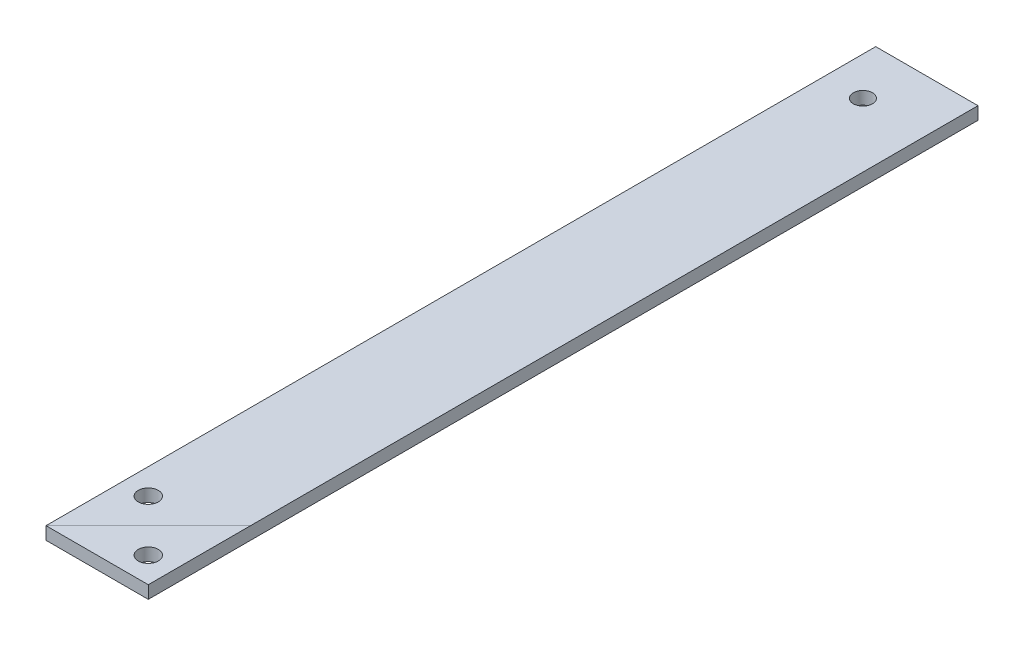
ISO-10303-21;
HEADER;
FILE_DESCRIPTION(('STEP AP214'),'2;1');
FILE_NAME('part.step','',(''),(''),'','','');
FILE_SCHEMA(('AUTOMOTIVE_DESIGN { 1 0 10303 214 1 1 1 1 }'));
ENDSEC;
DATA;
#1=APPLICATION_CONTEXT('core data for automotive mechanical design processes');
#2=APPLICATION_PROTOCOL_DEFINITION('international standard','automotive_design',2000,#1);
#3=PRODUCT_CONTEXT('',#1,'mechanical');
#4=PRODUCT('Part','Part','',(#3));
#5=PRODUCT_RELATED_PRODUCT_CATEGORY('part','',(#4));
#6=PRODUCT_DEFINITION_FORMATION('','',#4);
#7=PRODUCT_DEFINITION_CONTEXT('part definition',#1,'design');
#8=PRODUCT_DEFINITION('design','',#6,#7);
#9=PRODUCT_DEFINITION_SHAPE('','',#8);
#10=(LENGTH_UNIT() NAMED_UNIT(*) SI_UNIT(.MILLI.,.METRE.));
#11=(NAMED_UNIT(*) PLANE_ANGLE_UNIT() SI_UNIT($,.RADIAN.));
#12=(NAMED_UNIT(*) SI_UNIT($,.STERADIAN.) SOLID_ANGLE_UNIT());
#13=UNCERTAINTY_MEASURE_WITH_UNIT(LENGTH_MEASURE(1.E-05),#10,'distance_accuracy_value','');
#14=(GEOMETRIC_REPRESENTATION_CONTEXT(3) GLOBAL_UNCERTAINTY_ASSIGNED_CONTEXT((#13)) GLOBAL_UNIT_ASSIGNED_CONTEXT((#10,
#11,#12)) REPRESENTATION_CONTEXT('',''));
#15=CARTESIAN_POINT('',(0.,0.,0.));
#16=DIRECTION('',(0.,0.,1.));
#17=DIRECTION('',(1.,0.,0.));
#18=AXIS2_PLACEMENT_3D('',#15,#16,#17);
#19=CARTESIAN_POINT('',(0.,6.31,0.));
#20=DIRECTION('',(0.,1.,0.));
#21=DIRECTION('',(0.,0.,1.));
#22=AXIS2_PLACEMENT_3D('',#19,#20,#21);
#23=PLANE('',#22);
#24=CARTESIAN_POINT('',(-12.7000000000304,6.31,222.125660605838));
#25=DIRECTION('',(0.,1.,0.));
#26=DIRECTION('',(0.,0.,1.));
#27=AXIS2_PLACEMENT_3D('',#24,#25,#26);
#28=CIRCLE('',#27,5.);
#29=CARTESIAN_POINT('',(-12.7000000000304,6.31,227.125660605838));
#30=VERTEX_POINT('',#29);
#31=EDGE_CURVE('E186',#30,#30,#28,.T.);
#32=ORIENTED_EDGE('',*,*,#31,.F.);
#33=EDGE_LOOP('',(#32));
#34=FACE_BOUND('',#33,.T.);
#35=CARTESIAN_POINT('',(-6.36,6.31,-126.469999999989));
#36=DIRECTION('',(0.,1.,0.));
#37=DIRECTION('',(0.,0.,1.));
#38=AXIS2_PLACEMENT_3D('',#35,#36,#37);
#39=CIRCLE('',#38,4.7625);
#40=CARTESIAN_POINT('',(-6.36,6.31,-121.707499999989));
#41=VERTEX_POINT('',#40);
#42=EDGE_CURVE('E124',#41,#41,#39,.T.);
#43=ORIENTED_EDGE('',*,*,#42,.F.);
#44=EDGE_LOOP('',(#43));
#45=FACE_BOUND('',#44,.T.);
#46=DIRECTION('',(0.,0.,-1.));
#47=VECTOR('',#46,1.);
#48=CARTESIAN_POINT('',(25.4,6.31,151.87));
#49=LINE('',#48,#47);
#50=CARTESIAN_POINT('',(25.4,6.31,209.425660605845));
#51=VERTEX_POINT('',#50);
#52=CARTESIAN_POINT('',(25.4,6.31,-151.87));
#53=VERTEX_POINT('',#52);
#54=EDGE_CURVE('E99',#51,#53,#49,.T.);
#55=ORIENTED_EDGE('',*,*,#54,.T.);
#56=DIRECTION('',(-1.,0.,0.));
#57=VECTOR('',#56,1.);
#58=CARTESIAN_POINT('',(25.4,6.31,-151.87));
#59=LINE('',#58,#57);
#60=CARTESIAN_POINT('',(-25.4,6.31,-151.87));
#61=VERTEX_POINT('',#60);
#62=EDGE_CURVE('E58',#53,#61,#59,.T.);
#63=ORIENTED_EDGE('',*,*,#62,.T.);
#64=DIRECTION('',(0.,0.,1.));
#65=VECTOR('',#64,1.);
#66=CARTESIAN_POINT('',(-25.4,6.31,151.87));
#67=LINE('',#66,#65);
#68=CARTESIAN_POINT('',(-25.4,6.31,260.225660605844));
#69=VERTEX_POINT('',#68);
#70=EDGE_CURVE('E72',#61,#69,#67,.T.);
#71=ORIENTED_EDGE('',*,*,#70,.T.);
#72=DIRECTION('',(0.707106781186548,0.,-0.707106781186548));
#73=VECTOR('',#72,1.);
#74=CARTESIAN_POINT('',(28.7778303029223,6.31,206.047830302922));
#75=LINE('',#74,#73);
#76=EDGE_CURVE('E93',#69,#51,#75,.T.);
#77=ORIENTED_EDGE('',*,*,#76,.T.);
#78=EDGE_LOOP('',(#55,#63,#71,#77));
#79=FACE_BOUND('',#78,.T.);
#80=ADVANCED_FACE('F32',(#34,#45,#79),#23,.T.);
#81=CARTESIAN_POINT('',(-28.04,0.,260.225660605845));
#82=DIRECTION('',(0.,-1.,0.));
#83=DIRECTION('',(0.,0.,-1.));
#84=AXIS2_PLACEMENT_3D('',#81,#82,#83);
#85=PLANE('',#84);
#86=CARTESIAN_POINT('',(12.6999999999799,0.,247.525660605849));
#87=DIRECTION('',(0.,-1.,0.));
#88=DIRECTION('',(0.,0.,-1.));
#89=AXIS2_PLACEMENT_3D('',#86,#87,#88);
#90=CIRCLE('',#89,5.);
#91=CARTESIAN_POINT('',(12.6999999999799,0.,252.525660605849));
#92=VERTEX_POINT('',#91);
#93=EDGE_CURVE('E128',#92,#92,#90,.T.);
#94=ORIENTED_EDGE('',*,*,#93,.F.);
#95=EDGE_LOOP('',(#94));
#96=FACE_BOUND('',#95,.T.);
#97=DIRECTION('',(0.,0.,-1.));
#98=VECTOR('',#97,1.);
#99=CARTESIAN_POINT('',(25.4000000000001,0.,260.225660605844));
#100=LINE('',#99,#98);
#101=CARTESIAN_POINT('',(25.4000000000001,0.,260.225660605844));
#102=VERTEX_POINT('',#101);
#103=CARTESIAN_POINT('',(25.4,0.,209.425660605845));
#104=VERTEX_POINT('',#103);
#105=EDGE_CURVE('E109',#102,#104,#100,.T.);
#106=ORIENTED_EDGE('',*,*,#105,.F.);
#107=DIRECTION('',(1.,0.,0.));
#108=VECTOR('',#107,1.);
#109=CARTESIAN_POINT('',(-28.04,0.,260.225660605845));
#110=LINE('',#109,#108);
#111=CARTESIAN_POINT('',(-25.4,0.,260.225660605845));
#112=VERTEX_POINT('',#111);
#113=EDGE_CURVE('E114',#112,#102,#110,.T.);
#114=ORIENTED_EDGE('',*,*,#113,.F.);
#115=DIRECTION('',(-0.707106781186548,0.,0.707106781186548));
#116=VECTOR('',#115,1.);
#117=CARTESIAN_POINT('',(28.7778303029223,0.,206.047830302922));
#118=LINE('',#117,#116);
#119=EDGE_CURVE('E106',#104,#112,#118,.T.);
#120=ORIENTED_EDGE('',*,*,#119,.F.);
#121=EDGE_LOOP('',(#106,#114,#120));
#122=FACE_BOUND('',#121,.T.);
#123=ADVANCED_FACE('F145',(#96,#122),#85,.T.);
#124=CARTESIAN_POINT('',(-25.4,6.31,151.87));
#125=DIRECTION('',(1.,0.,0.));
#126=DIRECTION('',(0.,0.,-1.));
#127=AXIS2_PLACEMENT_3D('',#124,#125,#126);
#128=PLANE('',#127);
#129=DIRECTION('',(0.,0.,1.));
#130=VECTOR('',#129,1.);
#131=CARTESIAN_POINT('',(-25.4,0.,151.87));
#132=LINE('',#131,#130);
#133=CARTESIAN_POINT('',(-25.4,0.,-151.87));
#134=VERTEX_POINT('',#133);
#135=EDGE_CURVE('E80',#134,#112,#132,.T.);
#136=ORIENTED_EDGE('',*,*,#135,.T.);
#137=DIRECTION('',(0.,1.,0.));
#138=VECTOR('',#137,1.);
#139=CARTESIAN_POINT('',(-25.4,0.,260.225660605845));
#140=LINE('',#139,#138);
#141=EDGE_CURVE('E102',#112,#69,#140,.T.);
#142=ORIENTED_EDGE('',*,*,#141,.T.);
#143=ORIENTED_EDGE('',*,*,#70,.F.);
#144=DIRECTION('',(0.,-1.,0.));
#145=VECTOR('',#144,1.);
#146=CARTESIAN_POINT('',(-25.4,6.31,-151.87));
#147=LINE('',#146,#145);
#148=EDGE_CURVE('E41',#61,#134,#147,.T.);
#149=ORIENTED_EDGE('',*,*,#148,.T.);
#150=EDGE_LOOP('',(#136,#142,#143,#149));
#151=FACE_BOUND('',#150,.T.);
#152=ADVANCED_FACE('F34',(#151),#128,.F.);
#153=CARTESIAN_POINT('',(25.4,6.31,151.87));
#154=DIRECTION('',(-1.,0.,0.));
#155=DIRECTION('',(0.,0.,1.));
#156=AXIS2_PLACEMENT_3D('',#153,#154,#155);
#157=PLANE('',#156);
#158=DIRECTION('',(0.,-1.,0.));
#159=VECTOR('',#158,1.);
#160=CARTESIAN_POINT('',(25.4,6.31,-151.87));
#161=LINE('',#160,#159);
#162=CARTESIAN_POINT('',(25.4,0.,-151.87));
#163=VERTEX_POINT('',#162);
#164=EDGE_CURVE('E11',#53,#163,#161,.T.);
#165=ORIENTED_EDGE('',*,*,#164,.F.);
#166=ORIENTED_EDGE('',*,*,#54,.F.);
#167=DIRECTION('',(0.,0.,1.));
#168=VECTOR('',#167,1.);
#169=CARTESIAN_POINT('',(25.4,6.31,209.425660605845));
#170=LINE('',#169,#168);
#171=CARTESIAN_POINT('',(25.4,6.31,260.225660605845));
#172=VERTEX_POINT('',#171);
#173=EDGE_CURVE('E49',#51,#172,#170,.T.);
#174=ORIENTED_EDGE('',*,*,#173,.T.);
#175=DIRECTION('',(0.,1.,0.));
#176=VECTOR('',#175,1.);
#177=CARTESIAN_POINT('',(25.4000000000001,-91.49,260.225660605844));
#178=LINE('',#177,#176);
#179=EDGE_CURVE('E96',#102,#172,#178,.T.);
#180=ORIENTED_EDGE('',*,*,#179,.F.);
#181=ORIENTED_EDGE('',*,*,#105,.T.);
#182=DIRECTION('',(0.,0.,-1.));
#183=VECTOR('',#182,1.);
#184=CARTESIAN_POINT('',(25.4,0.,151.87));
#185=LINE('',#184,#183);
#186=EDGE_CURVE('E104',#104,#163,#185,.T.);
#187=ORIENTED_EDGE('',*,*,#186,.T.);
#188=EDGE_LOOP('',(#165,#166,#174,#180,#181,#187));
#189=FACE_BOUND('',#188,.T.);
#190=ADVANCED_FACE('F100',(#189),#157,.F.);
#191=CARTESIAN_POINT('',(25.4,6.31,-151.87));
#192=DIRECTION('',(0.,0.,1.));
#193=DIRECTION('',(1.,0.,0.));
#194=AXIS2_PLACEMENT_3D('',#191,#192,#193);
#195=PLANE('',#194);
#196=ORIENTED_EDGE('',*,*,#62,.F.);
#197=ORIENTED_EDGE('',*,*,#164,.T.);
#198=DIRECTION('',(-1.,0.,0.));
#199=VECTOR('',#198,1.);
#200=CARTESIAN_POINT('',(25.4,0.,-151.87));
#201=LINE('',#200,#199);
#202=EDGE_CURVE('E118',#163,#134,#201,.T.);
#203=ORIENTED_EDGE('',*,*,#202,.T.);
#204=ORIENTED_EDGE('',*,*,#148,.F.);
#205=EDGE_LOOP('',(#196,#197,#203,#204));
#206=FACE_BOUND('',#205,.T.);
#207=ADVANCED_FACE('F147',(#206),#195,.F.);
#208=CARTESIAN_POINT('',(0.,0.,0.));
#209=DIRECTION('',(0.,1.,0.));
#210=DIRECTION('',(0.,0.,1.));
#211=AXIS2_PLACEMENT_3D('',#208,#209,#210);
#212=PLANE('',#211);
#213=CARTESIAN_POINT('',(-12.7000000000304,0.,222.125660605838));
#214=DIRECTION('',(0.,1.,0.));
#215=DIRECTION('',(0.,0.,1.));
#216=AXIS2_PLACEMENT_3D('',#213,#214,#215);
#217=CIRCLE('',#216,5.);
#218=CARTESIAN_POINT('',(-12.7000000000304,0.,227.125660605838));
#219=VERTEX_POINT('',#218);
#220=EDGE_CURVE('E36',#219,#219,#217,.T.);
#221=ORIENTED_EDGE('',*,*,#220,.T.);
#222=EDGE_LOOP('',(#221));
#223=FACE_BOUND('',#222,.T.);
#224=CARTESIAN_POINT('',(-6.36,0.,-126.469999999989));
#225=DIRECTION('',(0.,1.,0.));
#226=DIRECTION('',(0.,0.,1.));
#227=AXIS2_PLACEMENT_3D('',#224,#225,#226);
#228=CIRCLE('',#227,4.7625);
#229=CARTESIAN_POINT('',(-6.36,0.,-121.707499999989));
#230=VERTEX_POINT('',#229);
#231=EDGE_CURVE('E97',#230,#230,#228,.T.);
#232=ORIENTED_EDGE('',*,*,#231,.T.);
#233=EDGE_LOOP('',(#232));
#234=FACE_BOUND('',#233,.T.);
#235=ORIENTED_EDGE('',*,*,#135,.F.);
#236=ORIENTED_EDGE('',*,*,#202,.F.);
#237=ORIENTED_EDGE('',*,*,#186,.F.);
#238=ORIENTED_EDGE('',*,*,#119,.T.);
#239=EDGE_LOOP('',(#235,#236,#237,#238));
#240=FACE_BOUND('',#239,.T.);
#241=ADVANCED_FACE('F144',(#223,#234,#240),#212,.F.);
#242=CARTESIAN_POINT('',(-28.04,6.31,260.225660605845));
#243=DIRECTION('',(0.,1.,0.));
#244=DIRECTION('',(0.,0.,1.));
#245=AXIS2_PLACEMENT_3D('',#242,#243,#244);
#246=PLANE('',#245);
#247=CARTESIAN_POINT('',(12.6999999999799,6.31,247.525660605849));
#248=DIRECTION('',(0.,1.,0.));
#249=DIRECTION('',(0.,0.,1.));
#250=AXIS2_PLACEMENT_3D('',#247,#248,#249);
#251=CIRCLE('',#250,5.);
#252=CARTESIAN_POINT('',(12.6999999999799,6.31,252.525660605849));
#253=VERTEX_POINT('',#252);
#254=EDGE_CURVE('E133',#253,#253,#251,.T.);
#255=ORIENTED_EDGE('',*,*,#254,.F.);
#256=EDGE_LOOP('',(#255));
#257=FACE_BOUND('',#256,.T.);
#258=ORIENTED_EDGE('',*,*,#173,.F.);
#259=ORIENTED_EDGE('',*,*,#76,.F.);
#260=DIRECTION('',(1.,0.,0.));
#261=VECTOR('',#260,1.);
#262=CARTESIAN_POINT('',(-28.04,6.31,260.225660605845));
#263=LINE('',#262,#261);
#264=EDGE_CURVE('E95',#69,#172,#263,.T.);
#265=ORIENTED_EDGE('',*,*,#264,.T.);
#266=EDGE_LOOP('',(#258,#259,#265));
#267=FACE_BOUND('',#266,.T.);
#268=ADVANCED_FACE('F92',(#257,#267),#246,.T.);
#269=CARTESIAN_POINT('',(-28.04,0.,260.225660605845));
#270=DIRECTION('',(0.,0.,1.));
#271=DIRECTION('',(0.,-1.,0.));
#272=AXIS2_PLACEMENT_3D('',#269,#270,#271);
#273=PLANE('',#272);
#274=ORIENTED_EDGE('',*,*,#179,.T.);
#275=ORIENTED_EDGE('',*,*,#264,.F.);
#276=ORIENTED_EDGE('',*,*,#141,.F.);
#277=ORIENTED_EDGE('',*,*,#113,.T.);
#278=EDGE_LOOP('',(#274,#275,#276,#277));
#279=FACE_BOUND('',#278,.T.);
#280=ADVANCED_FACE('F146',(#279),#273,.T.);
#281=CARTESIAN_POINT('',(-6.36,-3.215,-126.469999999989));
#282=DIRECTION('',(0.,1.,0.));
#283=DIRECTION('',(0.,0.,1.));
#284=AXIS2_PLACEMENT_3D('',#281,#282,#283);
#285=CYLINDRICAL_SURFACE('',#284,4.7625);
#286=CARTESIAN_POINT('',(-6.36,6.31,-121.707499999989));
#287=CARTESIAN_POINT('',(-6.36,6.24427083333333,-121.707499999989));
#288=CARTESIAN_POINT('',(-6.36,6.17854166666667,-121.707499999989));
#289=CARTESIAN_POINT('',(-6.36,6.04708333333333,-121.707499999989));
#290=CARTESIAN_POINT('',(-6.36,5.98135416666667,-121.707499999989));
#291=CARTESIAN_POINT('',(-6.36,5.84989583333333,-121.707499999989));
#292=CARTESIAN_POINT('',(-6.36,5.78416666666667,-121.707499999989));
#293=CARTESIAN_POINT('',(-6.36,5.65270833333333,-121.707499999989));
#294=CARTESIAN_POINT('',(-6.36,5.58697916666667,-121.707499999989));
#295=CARTESIAN_POINT('',(-6.36,5.45552083333333,-121.707499999989));
#296=CARTESIAN_POINT('',(-6.36,5.38979166666667,-121.707499999989));
#297=CARTESIAN_POINT('',(-6.36,5.25833333333333,-121.707499999989));
#298=CARTESIAN_POINT('',(-6.36,5.19260416666667,-121.707499999989));
#299=CARTESIAN_POINT('',(-6.36,5.06114583333333,-121.707499999989));
#300=CARTESIAN_POINT('',(-6.36,4.99541666666667,-121.707499999989));
#301=CARTESIAN_POINT('',(-6.36,4.86395833333333,-121.707499999989));
#302=CARTESIAN_POINT('',(-6.36,4.79822916666667,-121.707499999989));
#303=CARTESIAN_POINT('',(-6.36,4.66677083333333,-121.707499999989));
#304=CARTESIAN_POINT('',(-6.36,4.60104166666667,-121.707499999989));
#305=CARTESIAN_POINT('',(-6.36,4.46958333333333,-121.707499999989));
#306=CARTESIAN_POINT('',(-6.36,4.40385416666667,-121.707499999989));
#307=CARTESIAN_POINT('',(-6.36,4.27239583333333,-121.707499999989));
#308=CARTESIAN_POINT('',(-6.36,4.20666666666667,-121.707499999989));
#309=CARTESIAN_POINT('',(-6.36,4.07520833333333,-121.707499999989));
#310=CARTESIAN_POINT('',(-6.36,4.00947916666667,-121.707499999989));
#311=CARTESIAN_POINT('',(-6.36,3.87802083333333,-121.707499999989));
#312=CARTESIAN_POINT('',(-6.36,3.81229166666667,-121.707499999989));
#313=CARTESIAN_POINT('',(-6.36,3.68083333333333,-121.707499999989));
#314=CARTESIAN_POINT('',(-6.36,3.61510416666667,-121.707499999989));
#315=CARTESIAN_POINT('',(-6.36,3.48364583333333,-121.707499999989));
#316=CARTESIAN_POINT('',(-6.36,3.41791666666667,-121.707499999989));
#317=CARTESIAN_POINT('',(-6.36,3.28645833333333,-121.707499999989));
#318=CARTESIAN_POINT('',(-6.36,3.22072916666667,-121.707499999989));
#319=CARTESIAN_POINT('',(-6.36,3.08927083333333,-121.707499999989));
#320=CARTESIAN_POINT('',(-6.36,3.02354166666667,-121.707499999989));
#321=CARTESIAN_POINT('',(-6.36,2.89208333333333,-121.707499999989));
#322=CARTESIAN_POINT('',(-6.36,2.82635416666667,-121.707499999989));
#323=CARTESIAN_POINT('',(-6.36,2.69489583333333,-121.707499999989));
#324=CARTESIAN_POINT('',(-6.36,2.62916666666667,-121.707499999989));
#325=CARTESIAN_POINT('',(-6.36,2.49770833333333,-121.707499999989));
#326=CARTESIAN_POINT('',(-6.36,2.43197916666667,-121.707499999989));
#327=CARTESIAN_POINT('',(-6.36,2.30052083333333,-121.707499999989));
#328=CARTESIAN_POINT('',(-6.36,2.23479166666667,-121.707499999989));
#329=CARTESIAN_POINT('',(-6.36,2.10333333333333,-121.707499999989));
#330=CARTESIAN_POINT('',(-6.36,2.03760416666667,-121.707499999989));
#331=CARTESIAN_POINT('',(-6.36,1.90614583333333,-121.707499999989));
#332=CARTESIAN_POINT('',(-6.36,1.84041666666667,-121.707499999989));
#333=CARTESIAN_POINT('',(-6.36,1.70895833333333,-121.707499999989));
#334=CARTESIAN_POINT('',(-6.36,1.64322916666667,-121.707499999989));
#335=CARTESIAN_POINT('',(-6.36,1.51177083333333,-121.707499999989));
#336=CARTESIAN_POINT('',(-6.36,1.44604166666667,-121.707499999989));
#337=CARTESIAN_POINT('',(-6.36,1.31458333333333,-121.707499999989));
#338=CARTESIAN_POINT('',(-6.36,1.24885416666667,-121.707499999989));
#339=CARTESIAN_POINT('',(-6.36,1.11739583333333,-121.707499999989));
#340=CARTESIAN_POINT('',(-6.36,1.05166666666667,-121.707499999989));
#341=CARTESIAN_POINT('',(-6.36,0.920208333333332,-121.707499999989));
#342=CARTESIAN_POINT('',(-6.36,0.854479166666666,-121.707499999989));
#343=CARTESIAN_POINT('',(-6.36,0.723020833333333,-121.707499999989));
#344=CARTESIAN_POINT('',(-6.36,0.657291666666666,-121.707499999989));
#345=CARTESIAN_POINT('',(-6.36,0.525833333333333,-121.707499999989));
#346=CARTESIAN_POINT('',(-6.36,0.460104166666666,-121.707499999989));
#347=CARTESIAN_POINT('',(-6.36,0.328645833333333,-121.707499999989));
#348=CARTESIAN_POINT('',(-6.36,0.262916666666666,-121.707499999989));
#349=CARTESIAN_POINT('',(-6.36,0.131458333333333,-121.707499999989));
#350=CARTESIAN_POINT('',(-6.36,0.0657291666666664,-121.707499999989));
#351=CARTESIAN_POINT('',(-6.36,0.,-121.707499999989));
#352=B_SPLINE_CURVE_WITH_KNOTS('',3,(#286,#287,#288,#289,#290,#291,#292,#293,#294,#295,#296,
#297,#298,#299,#300,#301,#302,#303,#304,#305,#306,#307,#308,#309,#310,#311,#312,#313,#314,#315,
#316,#317,#318,#319,#320,#321,#322,#323,#324,#325,#326,#327,#328,#329,#330,#331,#332,#333,#334,
#335,#336,#337,#338,#339,#340,#341,#342,#343,#344,#345,#346,#347,#348,#349,#350,#351),
.UNSPECIFIED.,.F.,.F.,(4,2,2,2,2,2,2,2,2,2,2,2,2,2,2,2,2,2,2,2,2,2,2,2,2,2,2,2,2,2,2,2,4),(0.,
0.197187499999999,0.394375000000001,0.5915625,0.78875,0.985937500000001,1.183125,1.3803125,
1.5775,1.7746875,1.971875,2.1690625,2.36625,2.5634375,2.760625,2.9578125,3.155,3.3521875,
3.549375,3.7465625,3.94375,4.1409375,4.338125,4.5353125,4.7325,4.9296875,5.126875,5.3240625,
5.52125,5.7184375,5.915625,6.1128125,6.31),.UNSPECIFIED.);
#353=EDGE_CURVE('BSEAM169',#41,#230,#352,.T.);
#354=ORIENTED_EDGE('',*,*,#42,.T.);
#355=ORIENTED_EDGE('',*,*,#231,.F.);
#356=ORIENTED_EDGE('',*,*,#353,.T.);
#357=ORIENTED_EDGE('',*,*,#353,.F.);
#358=EDGE_LOOP('',(#354,#356,#355,#357));
#359=FACE_BOUND('',#358,.T.);
#360=ADVANCED_FACE('F169',(#359),#285,.F.);
#361=CARTESIAN_POINT('',(12.6999999999799,-3.215,247.525660605849));
#362=DIRECTION('',(0.,1.,0.));
#363=DIRECTION('',(0.,0.,1.));
#364=AXIS2_PLACEMENT_3D('',#361,#362,#363);
#365=CYLINDRICAL_SURFACE('',#364,5.);
#366=CARTESIAN_POINT('',(12.6999999999799,0.,252.525660605849));
#367=CARTESIAN_POINT('',(12.6999999999799,0.0657291666666671,252.525660605849));
#368=CARTESIAN_POINT('',(12.6999999999799,0.131458333333334,252.525660605849));
#369=CARTESIAN_POINT('',(12.6999999999799,0.262916666666667,252.525660605849));
#370=CARTESIAN_POINT('',(12.6999999999799,0.328645833333334,252.525660605849));
#371=CARTESIAN_POINT('',(12.6999999999799,0.460104166666667,252.525660605849));
#372=CARTESIAN_POINT('',(12.6999999999799,0.525833333333334,252.525660605849));
#373=CARTESIAN_POINT('',(12.6999999999799,0.657291666666667,252.525660605849));
#374=CARTESIAN_POINT('',(12.6999999999799,0.723020833333334,252.525660605849));
#375=CARTESIAN_POINT('',(12.6999999999799,0.854479166666667,252.525660605849));
#376=CARTESIAN_POINT('',(12.6999999999799,0.920208333333333,252.525660605849));
#377=CARTESIAN_POINT('',(12.6999999999799,1.05166666666667,252.525660605849));
#378=CARTESIAN_POINT('',(12.6999999999799,1.11739583333333,252.525660605849));
#379=CARTESIAN_POINT('',(12.6999999999799,1.24885416666667,252.525660605849));
#380=CARTESIAN_POINT('',(12.6999999999799,1.31458333333333,252.525660605849));
#381=CARTESIAN_POINT('',(12.6999999999799,1.44604166666667,252.525660605849));
#382=CARTESIAN_POINT('',(12.6999999999799,1.51177083333333,252.525660605849));
#383=CARTESIAN_POINT('',(12.6999999999799,1.64322916666667,252.525660605849));
#384=CARTESIAN_POINT('',(12.6999999999799,1.70895833333333,252.525660605849));
#385=CARTESIAN_POINT('',(12.6999999999799,1.84041666666667,252.525660605849));
#386=CARTESIAN_POINT('',(12.6999999999799,1.90614583333333,252.525660605849));
#387=CARTESIAN_POINT('',(12.6999999999799,2.03760416666667,252.525660605849));
#388=CARTESIAN_POINT('',(12.6999999999799,2.10333333333333,252.525660605849));
#389=CARTESIAN_POINT('',(12.6999999999799,2.23479166666667,252.525660605849));
#390=CARTESIAN_POINT('',(12.6999999999799,2.30052083333333,252.525660605849));
#391=CARTESIAN_POINT('',(12.6999999999799,2.43197916666667,252.525660605849));
#392=CARTESIAN_POINT('',(12.6999999999799,2.49770833333333,252.525660605849));
#393=CARTESIAN_POINT('',(12.6999999999799,2.62916666666667,252.525660605849));
#394=CARTESIAN_POINT('',(12.6999999999799,2.69489583333333,252.525660605849));
#395=CARTESIAN_POINT('',(12.6999999999799,2.82635416666667,252.525660605849));
#396=CARTESIAN_POINT('',(12.6999999999799,2.89208333333333,252.525660605849));
#397=CARTESIAN_POINT('',(12.6999999999799,3.02354166666667,252.525660605849));
#398=CARTESIAN_POINT('',(12.6999999999799,3.08927083333333,252.525660605849));
#399=CARTESIAN_POINT('',(12.6999999999799,3.22072916666667,252.525660605849));
#400=CARTESIAN_POINT('',(12.6999999999799,3.28645833333333,252.525660605849));
#401=CARTESIAN_POINT('',(12.6999999999799,3.41791666666667,252.525660605849));
#402=CARTESIAN_POINT('',(12.6999999999799,3.48364583333333,252.525660605849));
#403=CARTESIAN_POINT('',(12.6999999999799,3.61510416666667,252.525660605849));
#404=CARTESIAN_POINT('',(12.6999999999799,3.68083333333333,252.525660605849));
#405=CARTESIAN_POINT('',(12.6999999999799,3.81229166666667,252.525660605849));
#406=CARTESIAN_POINT('',(12.6999999999799,3.87802083333333,252.525660605849));
#407=CARTESIAN_POINT('',(12.6999999999799,4.00947916666667,252.525660605849));
#408=CARTESIAN_POINT('',(12.6999999999799,4.07520833333333,252.525660605849));
#409=CARTESIAN_POINT('',(12.6999999999799,4.20666666666667,252.525660605849));
#410=CARTESIAN_POINT('',(12.6999999999799,4.27239583333333,252.525660605849));
#411=CARTESIAN_POINT('',(12.6999999999799,4.40385416666667,252.525660605849));
#412=CARTESIAN_POINT('',(12.6999999999799,4.46958333333333,252.525660605849));
#413=CARTESIAN_POINT('',(12.6999999999799,4.60104166666667,252.525660605849));
#414=CARTESIAN_POINT('',(12.6999999999799,4.66677083333333,252.525660605849));
#415=CARTESIAN_POINT('',(12.6999999999799,4.79822916666667,252.525660605849));
#416=CARTESIAN_POINT('',(12.6999999999799,4.86395833333333,252.525660605849));
#417=CARTESIAN_POINT('',(12.6999999999799,4.99541666666667,252.525660605849));
#418=CARTESIAN_POINT('',(12.6999999999799,5.06114583333333,252.525660605849));
#419=CARTESIAN_POINT('',(12.6999999999799,5.19260416666667,252.525660605849));
#420=CARTESIAN_POINT('',(12.6999999999799,5.25833333333333,252.525660605849));
#421=CARTESIAN_POINT('',(12.6999999999799,5.38979166666667,252.525660605849));
#422=CARTESIAN_POINT('',(12.6999999999799,5.45552083333333,252.525660605849));
#423=CARTESIAN_POINT('',(12.6999999999799,5.58697916666667,252.525660605849));
#424=CARTESIAN_POINT('',(12.6999999999799,5.65270833333333,252.525660605849));
#425=CARTESIAN_POINT('',(12.6999999999799,5.78416666666667,252.525660605849));
#426=CARTESIAN_POINT('',(12.6999999999799,5.84989583333333,252.525660605849));
#427=CARTESIAN_POINT('',(12.6999999999799,5.98135416666667,252.525660605849));
#428=CARTESIAN_POINT('',(12.6999999999799,6.04708333333333,252.525660605849));
#429=CARTESIAN_POINT('',(12.6999999999799,6.17854166666667,252.525660605849));
#430=CARTESIAN_POINT('',(12.6999999999799,6.24427083333333,252.525660605849));
#431=CARTESIAN_POINT('',(12.6999999999799,6.31,252.525660605849));
#432=B_SPLINE_CURVE_WITH_KNOTS('',3,(#366,#367,#368,#369,#370,#371,#372,#373,#374,#375,#376,
#377,#378,#379,#380,#381,#382,#383,#384,#385,#386,#387,#388,#389,#390,#391,#392,#393,#394,#395,
#396,#397,#398,#399,#400,#401,#402,#403,#404,#405,#406,#407,#408,#409,#410,#411,#412,#413,#414,
#415,#416,#417,#418,#419,#420,#421,#422,#423,#424,#425,#426,#427,#428,#429,#430,#431),
.UNSPECIFIED.,.F.,.F.,(4,2,2,2,2,2,2,2,2,2,2,2,2,2,2,2,2,2,2,2,2,2,2,2,2,2,2,2,2,2,2,2,4),(0.,
0.1971875,0.394375,0.5915625,0.78875,0.985937499999999,1.183125,1.3803125,1.5775,1.7746875,
1.971875,2.1690625,2.36625,2.5634375,2.760625,2.9578125,3.155,3.3521875,3.549375,3.7465625,
3.94375,4.1409375,4.338125,4.5353125,4.7325,4.9296875,5.126875,5.3240625,5.52125,5.7184375,
5.915625,6.1128125,6.31),.UNSPECIFIED.);
#433=EDGE_CURVE('BSEAM175',#92,#253,#432,.T.);
#434=ORIENTED_EDGE('',*,*,#93,.T.);
#435=ORIENTED_EDGE('',*,*,#254,.T.);
#436=ORIENTED_EDGE('',*,*,#433,.T.);
#437=ORIENTED_EDGE('',*,*,#433,.F.);
#438=EDGE_LOOP('',(#434,#436,#435,#437));
#439=FACE_BOUND('',#438,.T.);
#440=ADVANCED_FACE('F175',(#439),#365,.F.);
#441=CARTESIAN_POINT('',(-12.7000000000304,-3.215,222.125660605838));
#442=DIRECTION('',(0.,1.,0.));
#443=DIRECTION('',(0.,0.,1.));
#444=AXIS2_PLACEMENT_3D('',#441,#442,#443);
#445=CYLINDRICAL_SURFACE('',#444,5.);
#446=CARTESIAN_POINT('',(-12.7000000000304,6.31,227.125660605838));
#447=CARTESIAN_POINT('',(-12.7000000000304,6.24427083333333,227.125660605838));
#448=CARTESIAN_POINT('',(-12.7000000000304,6.17854166666667,227.125660605838));
#449=CARTESIAN_POINT('',(-12.7000000000304,6.04708333333333,227.125660605838));
#450=CARTESIAN_POINT('',(-12.7000000000304,5.98135416666667,227.125660605838));
#451=CARTESIAN_POINT('',(-12.7000000000304,5.84989583333333,227.125660605838));
#452=CARTESIAN_POINT('',(-12.7000000000304,5.78416666666667,227.125660605838));
#453=CARTESIAN_POINT('',(-12.7000000000304,5.65270833333333,227.125660605838));
#454=CARTESIAN_POINT('',(-12.7000000000304,5.58697916666667,227.125660605838));
#455=CARTESIAN_POINT('',(-12.7000000000304,5.45552083333333,227.125660605838));
#456=CARTESIAN_POINT('',(-12.7000000000304,5.38979166666667,227.125660605838));
#457=CARTESIAN_POINT('',(-12.7000000000304,5.25833333333333,227.125660605838));
#458=CARTESIAN_POINT('',(-12.7000000000304,5.19260416666667,227.125660605838));
#459=CARTESIAN_POINT('',(-12.7000000000304,5.06114583333333,227.125660605838));
#460=CARTESIAN_POINT('',(-12.7000000000304,4.99541666666667,227.125660605838));
#461=CARTESIAN_POINT('',(-12.7000000000304,4.86395833333333,227.125660605838));
#462=CARTESIAN_POINT('',(-12.7000000000304,4.79822916666667,227.125660605838));
#463=CARTESIAN_POINT('',(-12.7000000000304,4.66677083333333,227.125660605838));
#464=CARTESIAN_POINT('',(-12.7000000000304,4.60104166666667,227.125660605838));
#465=CARTESIAN_POINT('',(-12.7000000000304,4.46958333333333,227.125660605838));
#466=CARTESIAN_POINT('',(-12.7000000000304,4.40385416666667,227.125660605838));
#467=CARTESIAN_POINT('',(-12.7000000000304,4.27239583333333,227.125660605838));
#468=CARTESIAN_POINT('',(-12.7000000000304,4.20666666666667,227.125660605838));
#469=CARTESIAN_POINT('',(-12.7000000000304,4.07520833333333,227.125660605838));
#470=CARTESIAN_POINT('',(-12.7000000000304,4.00947916666667,227.125660605838));
#471=CARTESIAN_POINT('',(-12.7000000000304,3.87802083333333,227.125660605838));
#472=CARTESIAN_POINT('',(-12.7000000000304,3.81229166666667,227.125660605838));
#473=CARTESIAN_POINT('',(-12.7000000000304,3.68083333333333,227.125660605838));
#474=CARTESIAN_POINT('',(-12.7000000000304,3.61510416666667,227.125660605838));
#475=CARTESIAN_POINT('',(-12.7000000000304,3.48364583333333,227.125660605838));
#476=CARTESIAN_POINT('',(-12.7000000000304,3.41791666666667,227.125660605838));
#477=CARTESIAN_POINT('',(-12.7000000000304,3.28645833333333,227.125660605838));
#478=CARTESIAN_POINT('',(-12.7000000000304,3.22072916666667,227.125660605838));
#479=CARTESIAN_POINT('',(-12.7000000000304,3.08927083333333,227.125660605838));
#480=CARTESIAN_POINT('',(-12.7000000000304,3.02354166666667,227.125660605838));
#481=CARTESIAN_POINT('',(-12.7000000000304,2.89208333333333,227.125660605838));
#482=CARTESIAN_POINT('',(-12.7000000000304,2.82635416666667,227.125660605838));
#483=CARTESIAN_POINT('',(-12.7000000000304,2.69489583333333,227.125660605838));
#484=CARTESIAN_POINT('',(-12.7000000000304,2.62916666666667,227.125660605838));
#485=CARTESIAN_POINT('',(-12.7000000000304,2.49770833333333,227.125660605838));
#486=CARTESIAN_POINT('',(-12.7000000000304,2.43197916666667,227.125660605838));
#487=CARTESIAN_POINT('',(-12.7000000000304,2.30052083333333,227.125660605838));
#488=CARTESIAN_POINT('',(-12.7000000000304,2.23479166666667,227.125660605838));
#489=CARTESIAN_POINT('',(-12.7000000000304,2.10333333333333,227.125660605838));
#490=CARTESIAN_POINT('',(-12.7000000000304,2.03760416666667,227.125660605838));
#491=CARTESIAN_POINT('',(-12.7000000000304,1.90614583333333,227.125660605838));
#492=CARTESIAN_POINT('',(-12.7000000000304,1.84041666666667,227.125660605838));
#493=CARTESIAN_POINT('',(-12.7000000000304,1.70895833333333,227.125660605838));
#494=CARTESIAN_POINT('',(-12.7000000000304,1.64322916666667,227.125660605838));
#495=CARTESIAN_POINT('',(-12.7000000000304,1.51177083333333,227.125660605838));
#496=CARTESIAN_POINT('',(-12.7000000000304,1.44604166666667,227.125660605838));
#497=CARTESIAN_POINT('',(-12.7000000000304,1.31458333333333,227.125660605838));
#498=CARTESIAN_POINT('',(-12.7000000000304,1.24885416666667,227.125660605838));
#499=CARTESIAN_POINT('',(-12.7000000000304,1.11739583333333,227.125660605838));
#500=CARTESIAN_POINT('',(-12.7000000000304,1.05166666666667,227.125660605838));
#501=CARTESIAN_POINT('',(-12.7000000000304,0.920208333333332,227.125660605838));
#502=CARTESIAN_POINT('',(-12.7000000000304,0.854479166666666,227.125660605838));
#503=CARTESIAN_POINT('',(-12.7000000000304,0.723020833333333,227.125660605838));
#504=CARTESIAN_POINT('',(-12.7000000000304,0.657291666666666,227.125660605838));
#505=CARTESIAN_POINT('',(-12.7000000000304,0.525833333333333,227.125660605838));
#506=CARTESIAN_POINT('',(-12.7000000000304,0.460104166666666,227.125660605838));
#507=CARTESIAN_POINT('',(-12.7000000000304,0.328645833333333,227.125660605838));
#508=CARTESIAN_POINT('',(-12.7000000000304,0.262916666666666,227.125660605838));
#509=CARTESIAN_POINT('',(-12.7000000000304,0.131458333333333,227.125660605838));
#510=CARTESIAN_POINT('',(-12.7000000000304,0.0657291666666664,227.125660605838));
#511=CARTESIAN_POINT('',(-12.7000000000304,0.,227.125660605838));
#512=B_SPLINE_CURVE_WITH_KNOTS('',3,(#446,#447,#448,#449,#450,#451,#452,#453,#454,#455,#456,
#457,#458,#459,#460,#461,#462,#463,#464,#465,#466,#467,#468,#469,#470,#471,#472,#473,#474,#475,
#476,#477,#478,#479,#480,#481,#482,#483,#484,#485,#486,#487,#488,#489,#490,#491,#492,#493,#494,
#495,#496,#497,#498,#499,#500,#501,#502,#503,#504,#505,#506,#507,#508,#509,#510,#511),
.UNSPECIFIED.,.F.,.F.,(4,2,2,2,2,2,2,2,2,2,2,2,2,2,2,2,2,2,2,2,2,2,2,2,2,2,2,2,2,2,2,2,4),(0.,
0.197187499999999,0.394375000000001,0.5915625,0.78875,0.985937500000001,1.183125,1.3803125,
1.5775,1.7746875,1.971875,2.1690625,2.36625,2.5634375,2.760625,2.9578125,3.155,3.3521875,
3.549375,3.7465625,3.94375,4.1409375,4.338125,4.5353125,4.7325,4.9296875,5.126875,5.3240625,
5.52125,5.7184375,5.915625,6.1128125,6.31),.UNSPECIFIED.);
#513=EDGE_CURVE('BSEAM178',#30,#219,#512,.T.);
#514=ORIENTED_EDGE('',*,*,#31,.T.);
#515=ORIENTED_EDGE('',*,*,#220,.F.);
#516=ORIENTED_EDGE('',*,*,#513,.T.);
#517=ORIENTED_EDGE('',*,*,#513,.F.);
#518=EDGE_LOOP('',(#514,#516,#515,#517));
#519=FACE_BOUND('',#518,.T.);
#520=ADVANCED_FACE('F178',(#519),#445,.F.);
#521=CLOSED_SHELL('',(#80,#123,#152,#190,#207,#241,#268,#280,#360,#440,#520));
#522=MANIFOLD_SOLID_BREP('B2',#521);
#523=ADVANCED_BREP_SHAPE_REPRESENTATION('',(#18,#522),#14);
#524=SHAPE_DEFINITION_REPRESENTATION(#9,#523);
ENDSEC;
END-ISO-10303-21;
